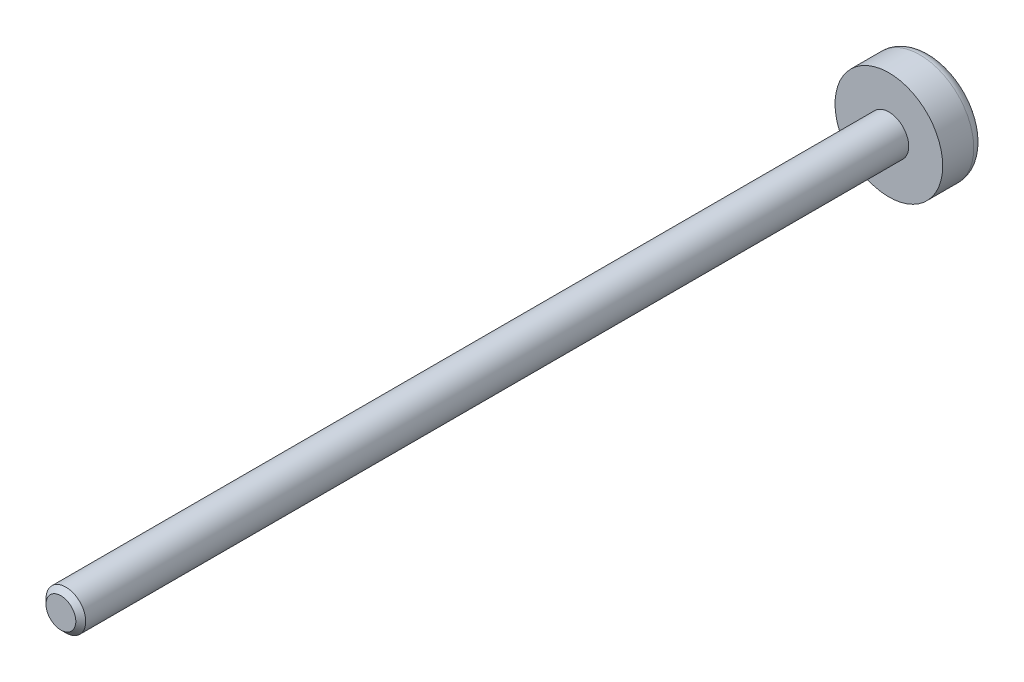
ISO-10303-21;
HEADER;
FILE_DESCRIPTION(('STEP AP214'),'2;1');
FILE_NAME('part.step','',(''),(''),'','','');
FILE_SCHEMA(('AUTOMOTIVE_DESIGN { 1 0 10303 214 1 1 1 1 }'));
ENDSEC;
DATA;
#1=APPLICATION_CONTEXT('core data for automotive mechanical design processes');
#2=APPLICATION_PROTOCOL_DEFINITION('international standard','automotive_design',2000,#1);
#3=PRODUCT_CONTEXT('',#1,'mechanical');
#4=PRODUCT('Part','Part','',(#3));
#5=PRODUCT_RELATED_PRODUCT_CATEGORY('part','',(#4));
#6=PRODUCT_DEFINITION_FORMATION('','',#4);
#7=PRODUCT_DEFINITION_CONTEXT('part definition',#1,'design');
#8=PRODUCT_DEFINITION('design','',#6,#7);
#9=PRODUCT_DEFINITION_SHAPE('','',#8);
#10=(LENGTH_UNIT() NAMED_UNIT(*) SI_UNIT(.MILLI.,.METRE.));
#11=(NAMED_UNIT(*) PLANE_ANGLE_UNIT() SI_UNIT($,.RADIAN.));
#12=(NAMED_UNIT(*) SI_UNIT($,.STERADIAN.) SOLID_ANGLE_UNIT());
#13=UNCERTAINTY_MEASURE_WITH_UNIT(LENGTH_MEASURE(1.E-05),#10,'distance_accuracy_value','');
#14=(GEOMETRIC_REPRESENTATION_CONTEXT(3) GLOBAL_UNCERTAINTY_ASSIGNED_CONTEXT((#13)) GLOBAL_UNIT_ASSIGNED_CONTEXT((#10,
#11,#12)) REPRESENTATION_CONTEXT('',''));
#15=CARTESIAN_POINT('',(0.,0.,0.));
#16=DIRECTION('',(0.,0.,1.));
#17=DIRECTION('',(1.,0.,0.));
#18=AXIS2_PLACEMENT_3D('',#15,#16,#17);
#19=CARTESIAN_POINT('',(0.,0.,50.));
#20=DIRECTION('',(0.,0.,1.));
#21=DIRECTION('',(-1.,0.,0.));
#22=AXIS2_PLACEMENT_3D('',#19,#20,#21);
#23=PLANE('',#22);
#24=CARTESIAN_POINT('',(0.,0.,50.));
#25=DIRECTION('',(0.,0.,-1.));
#26=DIRECTION('',(-1.,0.,0.));
#27=AXIS2_PLACEMENT_3D('',#24,#25,#26);
#28=CIRCLE('',#27,0.899999999999984);
#29=CARTESIAN_POINT('',(-0.899999999999984,0.,50.));
#30=VERTEX_POINT('',#29);
#31=EDGE_CURVE('E140',#30,#30,#28,.T.);
#32=ORIENTED_EDGE('',*,*,#31,.F.);
#33=EDGE_LOOP('',(#32));
#34=FACE_BOUND('',#33,.T.);
#35=ADVANCED_FACE('F41',(#34),#23,.T.);
#36=CARTESIAN_POINT('',(0.,0.,-10.123));
#37=DIRECTION('',(0.,0.,-1.));
#38=DIRECTION('',(1.,0.,0.));
#39=AXIS2_PLACEMENT_3D('',#36,#37,#38);
#40=CYLINDRICAL_SURFACE('',#39,1.2);
#41=CARTESIAN_POINT('',(0.,0.,49.7));
#42=DIRECTION('',(0.,0.,-1.));
#43=DIRECTION('',(-1.,0.,0.));
#44=AXIS2_PLACEMENT_3D('',#41,#42,#43);
#45=CIRCLE('',#44,1.2);
#46=CARTESIAN_POINT('',(-1.2,0.,49.7));
#47=VERTEX_POINT('',#46);
#48=EDGE_CURVE('E137',#47,#47,#45,.F.);
#49=ORIENTED_EDGE('',*,*,#48,.F.);
#50=EDGE_LOOP('',(#49));
#51=FACE_BOUND('',#50,.T.);
#52=CARTESIAN_POINT('',(0.,0.,0.));
#53=DIRECTION('',(0.,0.,1.));
#54=DIRECTION('',(1.,0.,0.));
#55=AXIS2_PLACEMENT_3D('',#52,#53,#54);
#56=CIRCLE('',#55,1.2);
#57=CARTESIAN_POINT('',(1.2,0.,0.));
#58=VERTEX_POINT('',#57);
#59=EDGE_CURVE('E134',#58,#58,#56,.T.);
#60=ORIENTED_EDGE('',*,*,#59,.T.);
#61=EDGE_LOOP('',(#60));
#62=FACE_BOUND('',#61,.T.);
#63=ADVANCED_FACE('F163',(#51,#62),#40,.T.);
#64=CARTESIAN_POINT('',(1.2,0.,0.));
#65=DIRECTION('',(0.,0.,1.));
#66=DIRECTION('',(-1.,0.,0.));
#67=AXIS2_PLACEMENT_3D('',#64,#65,#66);
#68=PLANE('',#67);
#69=ORIENTED_EDGE('',*,*,#59,.F.);
#70=EDGE_LOOP('',(#69));
#71=FACE_BOUND('',#70,.T.);
#72=CARTESIAN_POINT('',(0.,0.,0.));
#73=DIRECTION('',(0.,0.,1.));
#74=DIRECTION('',(1.,0.,0.));
#75=AXIS2_PLACEMENT_3D('',#72,#73,#74);
#76=CIRCLE('',#75,3.25);
#77=CARTESIAN_POINT('',(3.25,0.,0.));
#78=VERTEX_POINT('',#77);
#79=EDGE_CURVE('E131',#78,#78,#76,.T.);
#80=ORIENTED_EDGE('',*,*,#79,.T.);
#81=EDGE_LOOP('',(#80));
#82=FACE_BOUND('',#81,.T.);
#83=ADVANCED_FACE('F157',(#71,#82),#68,.T.);
#84=CARTESIAN_POINT('',(0.,0.,-10.123));
#85=DIRECTION('',(0.,0.,-1.));
#86=DIRECTION('',(1.,0.,0.));
#87=AXIS2_PLACEMENT_3D('',#84,#85,#86);
#88=CYLINDRICAL_SURFACE('',#87,3.25);
#89=CARTESIAN_POINT('',(0.,0.,-1.875));
#90=DIRECTION('',(0.,0.,1.));
#91=DIRECTION('',(1.,0.,0.));
#92=AXIS2_PLACEMENT_3D('',#89,#90,#91);
#93=CIRCLE('',#92,3.25);
#94=CARTESIAN_POINT('',(3.25,0.,-1.875));
#95=VERTEX_POINT('',#94);
#96=EDGE_CURVE('E11',#95,#95,#93,.F.);
#97=ORIENTED_EDGE('',*,*,#96,.F.);
#98=EDGE_LOOP('',(#97));
#99=FACE_BOUND('',#98,.T.);
#100=ORIENTED_EDGE('',*,*,#79,.F.);
#101=EDGE_LOOP('',(#100));
#102=FACE_BOUND('',#101,.T.);
#103=ADVANCED_FACE('F149',(#99,#102),#88,.T.);
#104=CARTESIAN_POINT('',(3.25,0.,-2.5));
#105=DIRECTION('',(0.,0.,-1.));
#106=DIRECTION('',(1.,0.,0.));
#107=AXIS2_PLACEMENT_3D('',#104,#105,#106);
#108=PLANE('',#107);
#109=DIRECTION('',(0.499999999999995,0.866025403784441,0.));
#110=VECTOR('',#109,1.);
#111=CARTESIAN_POINT('',(0.577350269189637,-0.999999999999993,-2.5));
#112=LINE('',#111,#110);
#113=CARTESIAN_POINT('',(0.577350269189637,-0.999999999999993,-2.5));
#114=VERTEX_POINT('',#113);
#115=CARTESIAN_POINT('',(1.15470053837925,0.,-2.5));
#116=VERTEX_POINT('',#115);
#117=EDGE_CURVE('E315',#114,#116,#112,.T.);
#118=ORIENTED_EDGE('',*,*,#117,.T.);
#119=DIRECTION('',(-0.500000000000001,0.866025403784438,0.));
#120=VECTOR('',#119,1.);
#121=CARTESIAN_POINT('',(1.15470053837925,0.,-2.5));
#122=LINE('',#121,#120);
#123=CARTESIAN_POINT('',(0.577350269189624,1.,-2.5));
#124=VERTEX_POINT('',#123);
#125=EDGE_CURVE('E310',#116,#124,#122,.T.);
#126=ORIENTED_EDGE('',*,*,#125,.T.);
#127=DIRECTION('',(-1.,0.,0.));
#128=VECTOR('',#127,1.);
#129=CARTESIAN_POINT('',(0.577350269189624,1.,-2.5));
#130=LINE('',#129,#128);
#131=CARTESIAN_POINT('',(-0.57735026918963,0.999999999999998,-2.5));
#132=VERTEX_POINT('',#131);
#133=EDGE_CURVE('E314',#124,#132,#130,.T.);
#134=ORIENTED_EDGE('',*,*,#133,.T.);
#135=DIRECTION('',(-0.499999999999995,-0.866025403784442,0.));
#136=VECTOR('',#135,1.);
#137=CARTESIAN_POINT('',(-0.57735026918963,0.999999999999998,-2.5));
#138=LINE('',#137,#136);
#139=CARTESIAN_POINT('',(-1.15470053837925,0.,-2.5));
#140=VERTEX_POINT('',#139);
#141=EDGE_CURVE('E322',#132,#140,#138,.T.);
#142=ORIENTED_EDGE('',*,*,#141,.T.);
#143=DIRECTION('',(0.500000000000007,-0.866025403784434,0.));
#144=VECTOR('',#143,1.);
#145=CARTESIAN_POINT('',(-1.15470053837925,0.,-2.5));
#146=LINE('',#145,#144);
#147=CARTESIAN_POINT('',(-0.577350269189617,-1.00000000000001,-2.5));
#148=VERTEX_POINT('',#147);
#149=EDGE_CURVE('E120',#140,#148,#146,.T.);
#150=ORIENTED_EDGE('',*,*,#149,.T.);
#151=DIRECTION('',(1.,0.,0.));
#152=VECTOR('',#151,1.);
#153=CARTESIAN_POINT('',(-0.577350269189617,-1.00000000000001,-2.5));
#154=LINE('',#153,#152);
#155=EDGE_CURVE('E317',#148,#114,#154,.T.);
#156=ORIENTED_EDGE('',*,*,#155,.T.);
#157=EDGE_LOOP('',(#118,#126,#134,#142,#150,#156));
#158=FACE_BOUND('',#157,.T.);
#159=CARTESIAN_POINT('',(0.,0.,-2.5));
#160=DIRECTION('',(0.,0.,1.));
#161=DIRECTION('',(1.,0.,0.));
#162=AXIS2_PLACEMENT_3D('',#159,#160,#161);
#163=CIRCLE('',#162,2.625);
#164=CARTESIAN_POINT('',(2.625,0.,-2.5));
#165=VERTEX_POINT('',#164);
#166=EDGE_CURVE('E49',#165,#165,#163,.T.);
#167=ORIENTED_EDGE('',*,*,#166,.F.);
#168=EDGE_LOOP('',(#167));
#169=FACE_BOUND('',#168,.T.);
#170=ADVANCED_FACE('F146',(#158,#169),#108,.T.);
#171=CARTESIAN_POINT('',(0.,0.,49.7));
#172=DIRECTION('',(0.,0.,-1.));
#173=DIRECTION('',(1.,0.,0.));
#174=AXIS2_PLACEMENT_3D('',#171,#172,#173);
#175=CONICAL_SURFACE('',#174,1.2,0.785398163397437);
#176=ORIENTED_EDGE('',*,*,#31,.T.);
#177=EDGE_LOOP('',(#176));
#178=FACE_BOUND('',#177,.T.);
#179=ORIENTED_EDGE('',*,*,#48,.T.);
#180=EDGE_LOOP('',(#179));
#181=FACE_BOUND('',#180,.T.);
#182=ADVANCED_FACE('F148',(#178,#181),#175,.T.);
#183=CARTESIAN_POINT('',(0.,0.,-1.875));
#184=DIRECTION('',(0.,0.,-1.));
#185=DIRECTION('',(1.,0.,0.));
#186=AXIS2_PLACEMENT_3D('',#183,#184,#185);
#187=TOROIDAL_SURFACE('',#186,2.625,0.625);
#188=ORIENTED_EDGE('',*,*,#96,.T.);
#189=EDGE_LOOP('',(#188));
#190=FACE_BOUND('',#189,.T.);
#191=ORIENTED_EDGE('',*,*,#166,.T.);
#192=EDGE_LOOP('',(#191));
#193=FACE_BOUND('',#192,.T.);
#194=ADVANCED_FACE('F43',(#190,#193),#187,.T.);
#195=CARTESIAN_POINT('',(0.577350269189637,-0.999999999999993,-1.125));
#196=DIRECTION('',(0.866025403784441,-0.499999999999995,0.));
#197=DIRECTION('',(0.499999999999995,0.866025403784441,0.));
#198=AXIS2_PLACEMENT_3D('',#195,#196,#197);
#199=PLANE('',#198);
#200=ORIENTED_EDGE('',*,*,#117,.F.);
#201=DIRECTION('',(0.,0.,-1.));
#202=VECTOR('',#201,1.);
#203=CARTESIAN_POINT('',(0.577350269189637,-0.999999999999993,-1.125));
#204=LINE('',#203,#202);
#205=CARTESIAN_POINT('',(0.577350269189637,-0.999999999999993,-1.125));
#206=VERTEX_POINT('',#205);
#207=EDGE_CURVE('E87',#206,#114,#204,.T.);
#208=ORIENTED_EDGE('',*,*,#207,.F.);
#209=DIRECTION('',(0.499999999999995,0.866025403784441,0.));
#210=VECTOR('',#209,1.);
#211=CARTESIAN_POINT('',(0.577350269189637,-0.999999999999993,-1.125));
#212=LINE('',#211,#210);
#213=CARTESIAN_POINT('',(1.15470053837925,0.,-1.125));
#214=VERTEX_POINT('',#213);
#215=EDGE_CURVE('E325',#206,#214,#212,.T.);
#216=ORIENTED_EDGE('',*,*,#215,.T.);
#217=DIRECTION('',(0.,0.,-1.));
#218=VECTOR('',#217,1.);
#219=CARTESIAN_POINT('',(1.15470053837925,0.,-1.125));
#220=LINE('',#219,#218);
#221=EDGE_CURVE('E56',#214,#116,#220,.T.);
#222=ORIENTED_EDGE('',*,*,#221,.T.);
#223=EDGE_LOOP('',(#200,#208,#216,#222));
#224=FACE_BOUND('',#223,.T.);
#225=ADVANCED_FACE('F210',(#224),#199,.F.);
#226=CARTESIAN_POINT('',(-0.577350269189617,-1.00000000000001,-1.125));
#227=DIRECTION('',(0.,-1.,0.));
#228=DIRECTION('',(1.,0.,0.));
#229=AXIS2_PLACEMENT_3D('',#226,#227,#228);
#230=PLANE('',#229);
#231=ORIENTED_EDGE('',*,*,#155,.F.);
#232=DIRECTION('',(0.,0.,-1.));
#233=VECTOR('',#232,1.);
#234=CARTESIAN_POINT('',(-0.577350269189617,-1.00000000000001,-1.125));
#235=LINE('',#234,#233);
#236=CARTESIAN_POINT('',(-0.577350269189617,-1.00000000000001,-1.125));
#237=VERTEX_POINT('',#236);
#238=EDGE_CURVE('E122',#237,#148,#235,.T.);
#239=ORIENTED_EDGE('',*,*,#238,.F.);
#240=DIRECTION('',(1.,0.,0.));
#241=VECTOR('',#240,1.);
#242=CARTESIAN_POINT('',(-0.577350269189617,-1.00000000000001,-1.125));
#243=LINE('',#242,#241);
#244=EDGE_CURVE('E65',#237,#206,#243,.T.);
#245=ORIENTED_EDGE('',*,*,#244,.T.);
#246=ORIENTED_EDGE('',*,*,#207,.T.);
#247=EDGE_LOOP('',(#231,#239,#245,#246));
#248=FACE_BOUND('',#247,.T.);
#249=ADVANCED_FACE('F220',(#248),#230,.F.);
#250=CARTESIAN_POINT('',(-1.15470053837925,0.,-1.125));
#251=DIRECTION('',(-0.866025403784435,-0.500000000000007,0.));
#252=DIRECTION('',(0.500000000000007,-0.866025403784435,0.));
#253=AXIS2_PLACEMENT_3D('',#250,#251,#252);
#254=PLANE('',#253);
#255=ORIENTED_EDGE('',*,*,#149,.F.);
#256=DIRECTION('',(0.,0.,-1.));
#257=VECTOR('',#256,1.);
#258=CARTESIAN_POINT('',(-1.15470053837925,0.,-1.125));
#259=LINE('',#258,#257);
#260=CARTESIAN_POINT('',(-1.15470053837925,0.,-1.125));
#261=VERTEX_POINT('',#260);
#262=EDGE_CURVE('E109',#261,#140,#259,.T.);
#263=ORIENTED_EDGE('',*,*,#262,.F.);
#264=DIRECTION('',(0.500000000000007,-0.866025403784434,0.));
#265=VECTOR('',#264,1.);
#266=CARTESIAN_POINT('',(-1.15470053837925,0.,-1.125));
#267=LINE('',#266,#265);
#268=EDGE_CURVE('E112',#261,#237,#267,.T.);
#269=ORIENTED_EDGE('',*,*,#268,.T.);
#270=ORIENTED_EDGE('',*,*,#238,.T.);
#271=EDGE_LOOP('',(#255,#263,#269,#270));
#272=FACE_BOUND('',#271,.T.);
#273=ADVANCED_FACE('F118',(#272),#254,.F.);
#274=CARTESIAN_POINT('',(-0.57735026918963,0.999999999999998,-1.125));
#275=DIRECTION('',(-0.866025403784442,0.499999999999995,0.));
#276=DIRECTION('',(-0.499999999999995,-0.866025403784441,0.));
#277=AXIS2_PLACEMENT_3D('',#274,#275,#276);
#278=PLANE('',#277);
#279=ORIENTED_EDGE('',*,*,#141,.F.);
#280=DIRECTION('',(0.,0.,-1.));
#281=VECTOR('',#280,1.);
#282=CARTESIAN_POINT('',(-0.57735026918963,0.999999999999998,-1.125));
#283=LINE('',#282,#281);
#284=CARTESIAN_POINT('',(-0.57735026918963,0.999999999999998,-1.125));
#285=VERTEX_POINT('',#284);
#286=EDGE_CURVE('E111',#285,#132,#283,.T.);
#287=ORIENTED_EDGE('',*,*,#286,.F.);
#288=DIRECTION('',(-0.499999999999995,-0.866025403784442,0.));
#289=VECTOR('',#288,1.);
#290=CARTESIAN_POINT('',(-0.57735026918963,0.999999999999998,-1.125));
#291=LINE('',#290,#289);
#292=EDGE_CURVE('E104',#285,#261,#291,.T.);
#293=ORIENTED_EDGE('',*,*,#292,.T.);
#294=ORIENTED_EDGE('',*,*,#262,.T.);
#295=EDGE_LOOP('',(#279,#287,#293,#294));
#296=FACE_BOUND('',#295,.T.);
#297=ADVANCED_FACE('F107',(#296),#278,.F.);
#298=CARTESIAN_POINT('',(0.577350269189624,1.,-1.125));
#299=DIRECTION('',(0.,1.,0.));
#300=DIRECTION('',(-1.,0.,0.));
#301=AXIS2_PLACEMENT_3D('',#298,#299,#300);
#302=PLANE('',#301);
#303=ORIENTED_EDGE('',*,*,#133,.F.);
#304=DIRECTION('',(0.,0.,-1.));
#305=VECTOR('',#304,1.);
#306=CARTESIAN_POINT('',(0.577350269189624,1.,-1.125));
#307=LINE('',#306,#305);
#308=CARTESIAN_POINT('',(0.577350269189624,1.,-1.125));
#309=VERTEX_POINT('',#308);
#310=EDGE_CURVE('E125',#309,#124,#307,.T.);
#311=ORIENTED_EDGE('',*,*,#310,.F.);
#312=DIRECTION('',(-1.,0.,0.));
#313=VECTOR('',#312,1.);
#314=CARTESIAN_POINT('',(0.577350269189624,1.,-1.125));
#315=LINE('',#314,#313);
#316=EDGE_CURVE('E113',#309,#285,#315,.T.);
#317=ORIENTED_EDGE('',*,*,#316,.T.);
#318=ORIENTED_EDGE('',*,*,#286,.T.);
#319=EDGE_LOOP('',(#303,#311,#317,#318));
#320=FACE_BOUND('',#319,.T.);
#321=ADVANCED_FACE('F247',(#320),#302,.F.);
#322=CARTESIAN_POINT('',(1.15470053837925,0.,-1.125));
#323=DIRECTION('',(0.866025403784438,0.500000000000001,0.));
#324=DIRECTION('',(-0.500000000000001,0.866025403784438,0.));
#325=AXIS2_PLACEMENT_3D('',#322,#323,#324);
#326=PLANE('',#325);
#327=ORIENTED_EDGE('',*,*,#125,.F.);
#328=ORIENTED_EDGE('',*,*,#221,.F.);
#329=DIRECTION('',(-0.500000000000001,0.866025403784438,0.));
#330=VECTOR('',#329,1.);
#331=CARTESIAN_POINT('',(1.15470053837925,0.,-1.125));
#332=LINE('',#331,#330);
#333=EDGE_CURVE('E95',#214,#309,#332,.T.);
#334=ORIENTED_EDGE('',*,*,#333,.T.);
#335=ORIENTED_EDGE('',*,*,#310,.T.);
#336=EDGE_LOOP('',(#327,#328,#334,#335));
#337=FACE_BOUND('',#336,.T.);
#338=ADVANCED_FACE('F257',(#337),#326,.F.);
#339=CARTESIAN_POINT('',(0.,0.,-1.125));
#340=DIRECTION('',(0.,0.,-1.));
#341=DIRECTION('',(1.,0.,0.));
#342=AXIS2_PLACEMENT_3D('',#339,#340,#341);
#343=PLANE('',#342);
#344=ORIENTED_EDGE('',*,*,#215,.F.);
#345=ORIENTED_EDGE('',*,*,#244,.F.);
#346=ORIENTED_EDGE('',*,*,#268,.F.);
#347=ORIENTED_EDGE('',*,*,#292,.F.);
#348=ORIENTED_EDGE('',*,*,#316,.F.);
#349=ORIENTED_EDGE('',*,*,#333,.F.);
#350=EDGE_LOOP('',(#344,#345,#346,#347,#348,#349));
#351=FACE_BOUND('',#350,.T.);
#352=ADVANCED_FACE('F115',(#351),#343,.T.);
#353=CLOSED_SHELL('',(#35,#63,#83,#103,#170,#182,#194,#225,#249,#273,#297,#321,#338,#352));
#354=MANIFOLD_SOLID_BREP('B2',#353);
#355=ADVANCED_BREP_SHAPE_REPRESENTATION('',(#18,#354),#14);
#356=SHAPE_DEFINITION_REPRESENTATION(#9,#355);
ENDSEC;
END-ISO-10303-21;
